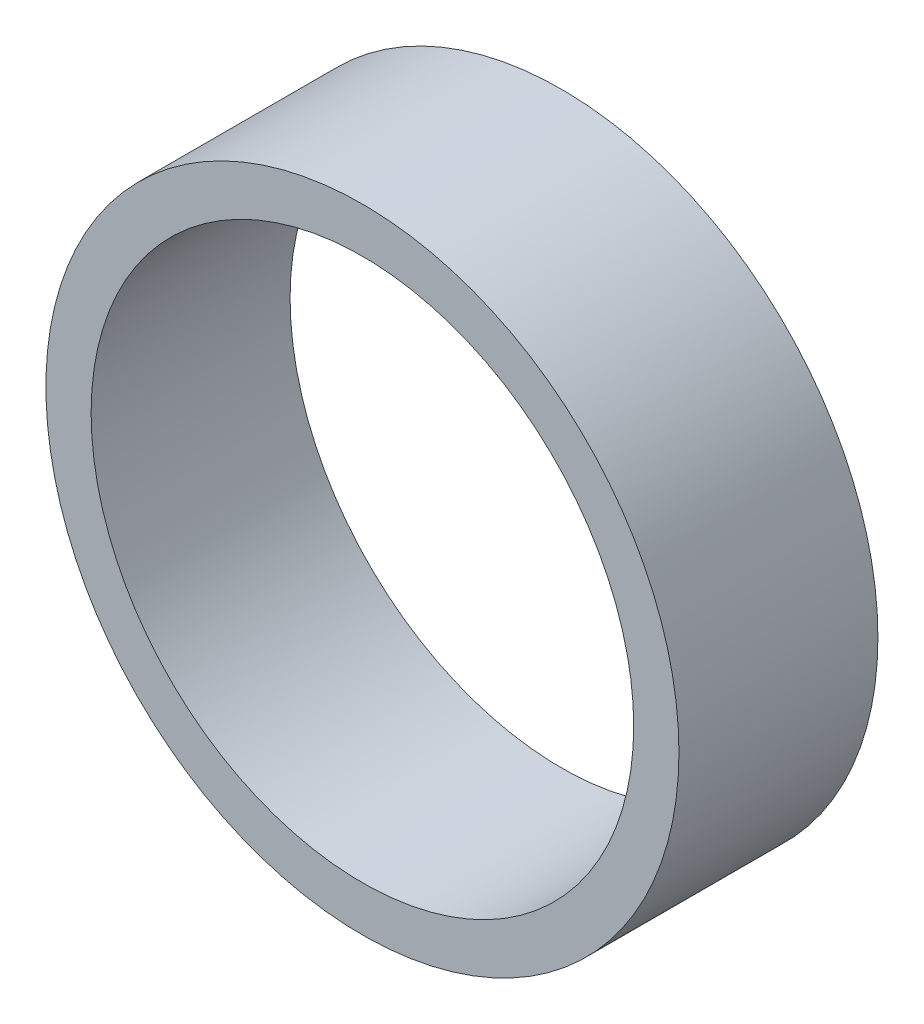
ISO-10303-21;
HEADER;
FILE_DESCRIPTION(('STEP AP214'),'2;1');
FILE_NAME('part.step','',(''),(''),'','','');
FILE_SCHEMA(('AUTOMOTIVE_DESIGN { 1 0 10303 214 1 1 1 1 }'));
ENDSEC;
DATA;
#1=APPLICATION_CONTEXT('core data for automotive mechanical design processes');
#2=APPLICATION_PROTOCOL_DEFINITION('international standard','automotive_design',2000,#1);
#3=PRODUCT_CONTEXT('',#1,'mechanical');
#4=PRODUCT('Part','Part','',(#3));
#5=PRODUCT_RELATED_PRODUCT_CATEGORY('part','',(#4));
#6=PRODUCT_DEFINITION_FORMATION('','',#4);
#7=PRODUCT_DEFINITION_CONTEXT('part definition',#1,'design');
#8=PRODUCT_DEFINITION('design','',#6,#7);
#9=PRODUCT_DEFINITION_SHAPE('','',#8);
#10=(LENGTH_UNIT() NAMED_UNIT(*) SI_UNIT(.MILLI.,.METRE.));
#11=(NAMED_UNIT(*) PLANE_ANGLE_UNIT() SI_UNIT($,.RADIAN.));
#12=(NAMED_UNIT(*) SI_UNIT($,.STERADIAN.) SOLID_ANGLE_UNIT());
#13=UNCERTAINTY_MEASURE_WITH_UNIT(LENGTH_MEASURE(1.E-05),#10,'distance_accuracy_value','');
#14=(GEOMETRIC_REPRESENTATION_CONTEXT(3) GLOBAL_UNCERTAINTY_ASSIGNED_CONTEXT((#13)) GLOBAL_UNIT_ASSIGNED_CONTEXT((#10,
#11,#12)) REPRESENTATION_CONTEXT('',''));
#15=CARTESIAN_POINT('',(0.,0.,0.));
#16=DIRECTION('',(0.,0.,1.));
#17=DIRECTION('',(1.,0.,0.));
#18=AXIS2_PLACEMENT_3D('',#15,#16,#17);
#19=CARTESIAN_POINT('',(0.,0.,-3.3));
#20=DIRECTION('',(0.,0.,1.));
#21=DIRECTION('',(1.,0.,0.));
#22=AXIS2_PLACEMENT_3D('',#19,#20,#21);
#23=CYLINDRICAL_SURFACE('',#22,5.25);
#24=CARTESIAN_POINT('',(0.,0.,-3.3));
#25=DIRECTION('',(0.,0.,1.));
#26=DIRECTION('',(1.,0.,0.));
#27=AXIS2_PLACEMENT_3D('',#24,#25,#26);
#28=CIRCLE('',#27,5.25);
#29=CARTESIAN_POINT('',(5.25,0.,-3.3));
#30=VERTEX_POINT('',#29);
#31=EDGE_CURVE('E10',#30,#30,#28,.T.);
#32=ORIENTED_EDGE('',*,*,#31,.T.);
#33=EDGE_LOOP('',(#32));
#34=FACE_BOUND('',#33,.T.);
#35=CARTESIAN_POINT('',(0.,0.,0.));
#36=DIRECTION('',(0.,0.,1.));
#37=DIRECTION('',(1.,0.,0.));
#38=AXIS2_PLACEMENT_3D('',#35,#36,#37);
#39=CIRCLE('',#38,5.25);
#40=CARTESIAN_POINT('',(5.25,0.,0.));
#41=VERTEX_POINT('',#40);
#42=EDGE_CURVE('E38',#41,#41,#39,.T.);
#43=ORIENTED_EDGE('',*,*,#42,.F.);
#44=EDGE_LOOP('',(#43));
#45=FACE_BOUND('',#44,.T.);
#46=ADVANCED_FACE('F35',(#34,#45),#23,.T.);
#47=CARTESIAN_POINT('',(0.,0.,-3.3));
#48=DIRECTION('',(0.,0.,1.));
#49=DIRECTION('',(1.,0.,0.));
#50=AXIS2_PLACEMENT_3D('',#47,#48,#49);
#51=PLANE('',#50);
#52=CARTESIAN_POINT('',(0.,0.,-3.3));
#53=DIRECTION('',(0.,0.,1.));
#54=DIRECTION('',(1.,0.,0.));
#55=AXIS2_PLACEMENT_3D('',#52,#53,#54);
#56=CIRCLE('',#55,4.5);
#57=CARTESIAN_POINT('',(4.5,0.,-3.3));
#58=VERTEX_POINT('',#57);
#59=EDGE_CURVE('E45',#58,#58,#56,.T.);
#60=ORIENTED_EDGE('',*,*,#59,.T.);
#61=EDGE_LOOP('',(#60));
#62=FACE_BOUND('',#61,.T.);
#63=ORIENTED_EDGE('',*,*,#31,.F.);
#64=EDGE_LOOP('',(#63));
#65=FACE_BOUND('',#64,.T.);
#66=ADVANCED_FACE('F53',(#62,#65),#51,.F.);
#67=CARTESIAN_POINT('',(0.,0.,0.));
#68=DIRECTION('',(0.,0.,1.));
#69=DIRECTION('',(1.,0.,0.));
#70=AXIS2_PLACEMENT_3D('',#67,#68,#69);
#71=PLANE('',#70);
#72=CARTESIAN_POINT('',(0.,0.,0.));
#73=DIRECTION('',(0.,0.,1.));
#74=DIRECTION('',(1.,0.,0.));
#75=AXIS2_PLACEMENT_3D('',#72,#73,#74);
#76=CIRCLE('',#75,4.5);
#77=CARTESIAN_POINT('',(4.5,0.,0.));
#78=VERTEX_POINT('',#77);
#79=EDGE_CURVE('E47',#78,#78,#76,.T.);
#80=ORIENTED_EDGE('',*,*,#79,.F.);
#81=EDGE_LOOP('',(#80));
#82=FACE_BOUND('',#81,.T.);
#83=ORIENTED_EDGE('',*,*,#42,.T.);
#84=EDGE_LOOP('',(#83));
#85=FACE_BOUND('',#84,.T.);
#86=ADVANCED_FACE('F59',(#82,#85),#71,.T.);
#87=CARTESIAN_POINT('',(0.,0.,-3.3));
#88=DIRECTION('',(0.,0.,1.));
#89=DIRECTION('',(1.,0.,0.));
#90=AXIS2_PLACEMENT_3D('',#87,#88,#89);
#91=CYLINDRICAL_SURFACE('',#90,4.5);
#92=ORIENTED_EDGE('',*,*,#59,.F.);
#93=EDGE_LOOP('',(#92));
#94=FACE_BOUND('',#93,.T.);
#95=ORIENTED_EDGE('',*,*,#79,.T.);
#96=EDGE_LOOP('',(#95));
#97=FACE_BOUND('',#96,.T.);
#98=ADVANCED_FACE('F56',(#94,#97),#91,.F.);
#99=CLOSED_SHELL('',(#46,#66,#86,#98));
#100=MANIFOLD_SOLID_BREP('B2',#99);
#101=ADVANCED_BREP_SHAPE_REPRESENTATION('',(#18,#100),#14);
#102=SHAPE_DEFINITION_REPRESENTATION(#9,#101);
ENDSEC;
END-ISO-10303-21;
